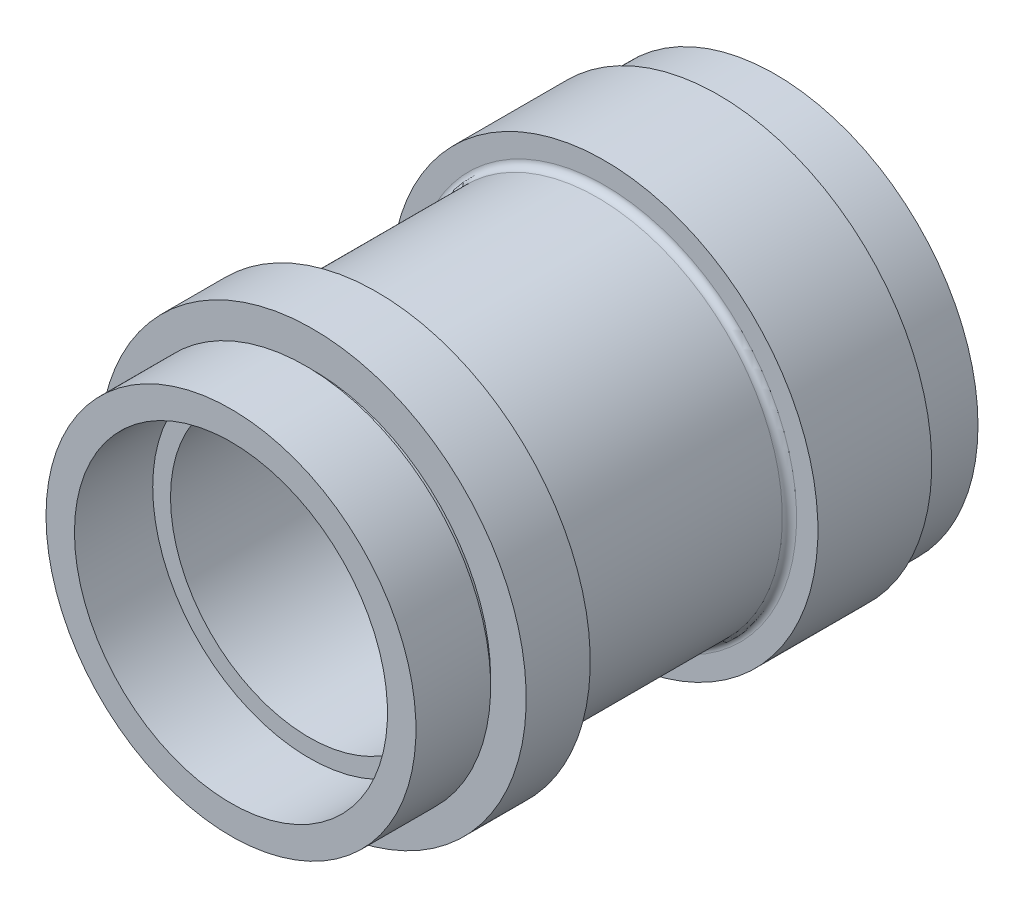
ISO-10303-21;
HEADER;
FILE_DESCRIPTION(('STEP AP214'),'2;1');
FILE_NAME('part.step','',(''),(''),'','','');
FILE_SCHEMA(('AUTOMOTIVE_DESIGN { 1 0 10303 214 1 1 1 1 }'));
ENDSEC;
DATA;
#1=APPLICATION_CONTEXT('core data for automotive mechanical design processes');
#2=APPLICATION_PROTOCOL_DEFINITION('international standard','automotive_design',2000,#1);
#3=PRODUCT_CONTEXT('',#1,'mechanical');
#4=PRODUCT('Part','Part','',(#3));
#5=PRODUCT_RELATED_PRODUCT_CATEGORY('part','',(#4));
#6=PRODUCT_DEFINITION_FORMATION('','',#4);
#7=PRODUCT_DEFINITION_CONTEXT('part definition',#1,'design');
#8=PRODUCT_DEFINITION('design','',#6,#7);
#9=PRODUCT_DEFINITION_SHAPE('','',#8);
#10=(LENGTH_UNIT() NAMED_UNIT(*) SI_UNIT(.MILLI.,.METRE.));
#11=(NAMED_UNIT(*) PLANE_ANGLE_UNIT() SI_UNIT($,.RADIAN.));
#12=(NAMED_UNIT(*) SI_UNIT($,.STERADIAN.) SOLID_ANGLE_UNIT());
#13=UNCERTAINTY_MEASURE_WITH_UNIT(LENGTH_MEASURE(1.E-05),#10,'distance_accuracy_value','');
#14=(GEOMETRIC_REPRESENTATION_CONTEXT(3) GLOBAL_UNCERTAINTY_ASSIGNED_CONTEXT((#13)) GLOBAL_UNIT_ASSIGNED_CONTEXT((#10,
#11,#12)) REPRESENTATION_CONTEXT('',''));
#15=CARTESIAN_POINT('',(0.,0.,0.));
#16=DIRECTION('',(0.,0.,1.));
#17=DIRECTION('',(1.,0.,0.));
#18=AXIS2_PLACEMENT_3D('',#15,#16,#17);
#19=CARTESIAN_POINT('',(0.,0.,32.5));
#20=DIRECTION('',(0.,0.,-1.));
#21=DIRECTION('',(-1.,0.,0.));
#22=AXIS2_PLACEMENT_3D('',#19,#20,#21);
#23=CYLINDRICAL_SURFACE('',#22,15.);
#24=CARTESIAN_POINT('',(0.,0.,28.));
#25=DIRECTION('',(0.,0.,-1.));
#26=DIRECTION('',(-1.,0.,0.));
#27=AXIS2_PLACEMENT_3D('',#24,#25,#26);
#28=CIRCLE('',#27,15.);
#29=CARTESIAN_POINT('',(-15.,0.,28.));
#30=VERTEX_POINT('',#29);
#31=EDGE_CURVE('E103',#30,#30,#28,.T.);
#32=CARTESIAN_POINT('',(0.,0.,32.5));
#33=DIRECTION('',(0.,0.,1.));
#34=DIRECTION('',(1.,0.,0.));
#35=AXIS2_PLACEMENT_3D('',#32,#33,#34);
#36=CIRCLE('',#35,15.);
#37=CARTESIAN_POINT('',(-15.,0.,32.5));
#38=VERTEX_POINT('',#37);
#39=EDGE_CURVE('E136',#38,#38,#36,.T.);
#40=CARTESIAN_POINT('',(-15.,0.,28.));
#41=CARTESIAN_POINT('',(-15.,0.,28.046875));
#42=CARTESIAN_POINT('',(-15.,0.,28.09375));
#43=CARTESIAN_POINT('',(-15.,0.,28.1875));
#44=CARTESIAN_POINT('',(-15.,0.,28.234375));
#45=CARTESIAN_POINT('',(-15.,0.,28.328125));
#46=CARTESIAN_POINT('',(-15.,0.,28.375));
#47=CARTESIAN_POINT('',(-15.,0.,28.46875));
#48=CARTESIAN_POINT('',(-15.,0.,28.515625));
#49=CARTESIAN_POINT('',(-15.,0.,28.609375));
#50=CARTESIAN_POINT('',(-15.,0.,28.65625));
#51=CARTESIAN_POINT('',(-15.,0.,28.75));
#52=CARTESIAN_POINT('',(-15.,0.,28.796875));
#53=CARTESIAN_POINT('',(-15.,0.,28.890625));
#54=CARTESIAN_POINT('',(-15.,0.,28.9375));
#55=CARTESIAN_POINT('',(-15.,0.,29.03125));
#56=CARTESIAN_POINT('',(-15.,0.,29.078125));
#57=CARTESIAN_POINT('',(-15.,0.,29.171875));
#58=CARTESIAN_POINT('',(-15.,0.,29.21875));
#59=CARTESIAN_POINT('',(-15.,0.,29.3125));
#60=CARTESIAN_POINT('',(-15.,0.,29.359375));
#61=CARTESIAN_POINT('',(-15.,0.,29.453125));
#62=CARTESIAN_POINT('',(-15.,0.,29.5));
#63=CARTESIAN_POINT('',(-15.,0.,29.59375));
#64=CARTESIAN_POINT('',(-15.,0.,29.640625));
#65=CARTESIAN_POINT('',(-15.,0.,29.734375));
#66=CARTESIAN_POINT('',(-15.,0.,29.78125));
#67=CARTESIAN_POINT('',(-15.,0.,29.875));
#68=CARTESIAN_POINT('',(-15.,0.,29.921875));
#69=CARTESIAN_POINT('',(-15.,0.,30.015625));
#70=CARTESIAN_POINT('',(-15.,0.,30.0625));
#71=CARTESIAN_POINT('',(-15.,0.,30.15625));
#72=CARTESIAN_POINT('',(-15.,0.,30.203125));
#73=CARTESIAN_POINT('',(-15.,0.,30.296875));
#74=CARTESIAN_POINT('',(-15.,0.,30.34375));
#75=CARTESIAN_POINT('',(-15.,0.,30.4375));
#76=CARTESIAN_POINT('',(-15.,0.,30.484375));
#77=CARTESIAN_POINT('',(-15.,0.,30.578125));
#78=CARTESIAN_POINT('',(-15.,0.,30.625));
#79=CARTESIAN_POINT('',(-15.,0.,30.71875));
#80=CARTESIAN_POINT('',(-15.,0.,30.765625));
#81=CARTESIAN_POINT('',(-15.,0.,30.859375));
#82=CARTESIAN_POINT('',(-15.,0.,30.90625));
#83=CARTESIAN_POINT('',(-15.,0.,31.));
#84=CARTESIAN_POINT('',(-15.,0.,31.046875));
#85=CARTESIAN_POINT('',(-15.,0.,31.140625));
#86=CARTESIAN_POINT('',(-15.,0.,31.1875));
#87=CARTESIAN_POINT('',(-15.,0.,31.28125));
#88=CARTESIAN_POINT('',(-15.,0.,31.328125));
#89=CARTESIAN_POINT('',(-15.,0.,31.421875));
#90=CARTESIAN_POINT('',(-15.,0.,31.46875));
#91=CARTESIAN_POINT('',(-15.,0.,31.5625));
#92=CARTESIAN_POINT('',(-15.,0.,31.609375));
#93=CARTESIAN_POINT('',(-15.,0.,31.703125));
#94=CARTESIAN_POINT('',(-15.,0.,31.75));
#95=CARTESIAN_POINT('',(-15.,0.,31.84375));
#96=CARTESIAN_POINT('',(-15.,0.,31.890625));
#97=CARTESIAN_POINT('',(-15.,0.,31.984375));
#98=CARTESIAN_POINT('',(-15.,0.,32.03125));
#99=CARTESIAN_POINT('',(-15.,0.,32.125));
#100=CARTESIAN_POINT('',(-15.,0.,32.171875));
#101=CARTESIAN_POINT('',(-15.,0.,32.265625));
#102=CARTESIAN_POINT('',(-15.,0.,32.3125));
#103=CARTESIAN_POINT('',(-15.,0.,32.40625));
#104=CARTESIAN_POINT('',(-15.,0.,32.453125));
#105=CARTESIAN_POINT('',(-15.,0.,32.5));
#106=B_SPLINE_CURVE_WITH_KNOTS('',3,(#40,#41,#42,#43,#44,#45,#46,#47,#48,#49,#50,#51,#52,#53,
#54,#55,#56,#57,#58,#59,#60,#61,#62,#63,#64,#65,#66,#67,#68,#69,#70,#71,#72,#73,#74,#75,#76,#77,
#78,#79,#80,#81,#82,#83,#84,#85,#86,#87,#88,#89,#90,#91,#92,#93,#94,#95,#96,#97,#98,#99,#100,
#101,#102,#103,#104,#105),.UNSPECIFIED.,.F.,.F.,(4,2,2,2,2,2,2,2,2,2,2,2,2,2,2,2,2,2,2,2,2,2,2,
2,2,2,2,2,2,2,2,2,4),(0.,0.140624999999998,0.28125,0.421874999999999,0.562499999999997,
0.703124999999999,0.843749999999997,0.984374999999996,1.125,1.265625,1.40624999999999,1.546875,
1.68749999999999,1.828125,1.96874999999999,2.10937499999999,2.25,2.39062499999999,2.53125,
2.67187499999999,2.81249999999999,2.95312499999999,3.09374999999999,3.23437499999999,
3.37499999999999,3.51562499999999,3.65624999999999,3.79687499999999,3.93749999999999,
4.07812499999999,4.21874999999999,4.35937499999999,4.49999999999999),.UNSPECIFIED.);
#107=EDGE_CURVE('BSEAM53',#30,#38,#106,.T.);
#108=ORIENTED_EDGE('',*,*,#31,.F.);
#109=ORIENTED_EDGE('',*,*,#39,.F.);
#110=ORIENTED_EDGE('',*,*,#107,.T.);
#111=ORIENTED_EDGE('',*,*,#107,.F.);
#112=EDGE_LOOP('',(#108,#110,#109,#111));
#113=FACE_BOUND('',#112,.T.);
#114=ADVANCED_FACE('F53',(#113),#23,.T.);
#115=CARTESIAN_POINT('',(0.,0.,32.5));
#116=DIRECTION('',(0.,0.,1.));
#117=DIRECTION('',(1.,0.,0.));
#118=AXIS2_PLACEMENT_3D('',#115,#116,#117);
#119=PLANE('',#118);
#120=CARTESIAN_POINT('',(0.,0.,32.5));
#121=DIRECTION('',(0.,0.,1.));
#122=DIRECTION('',(1.,0.,0.));
#123=AXIS2_PLACEMENT_3D('',#120,#121,#122);
#124=CIRCLE('',#123,12.5);
#125=CARTESIAN_POINT('',(12.5,0.,32.5));
#126=VERTEX_POINT('',#125);
#127=EDGE_CURVE('E11',#126,#126,#124,.T.);
#128=ORIENTED_EDGE('',*,*,#127,.F.);
#129=EDGE_LOOP('',(#128));
#130=FACE_BOUND('',#129,.T.);
#131=ORIENTED_EDGE('',*,*,#39,.T.);
#132=EDGE_LOOP('',(#131));
#133=FACE_BOUND('',#132,.T.);
#134=ADVANCED_FACE('F169',(#130,#133),#119,.T.);
#135=CARTESIAN_POINT('',(0.,0.,33.));
#136=DIRECTION('',(0.,0.,-1.));
#137=DIRECTION('',(-1.,0.,0.));
#138=AXIS2_PLACEMENT_3D('',#135,#136,#137);
#139=CYLINDRICAL_SURFACE('',#138,12.5);
#140=CARTESIAN_POINT('',(0.,0.,33.));
#141=DIRECTION('',(0.,0.,1.));
#142=DIRECTION('',(1.,0.,0.));
#143=AXIS2_PLACEMENT_3D('',#140,#141,#142);
#144=CIRCLE('',#143,12.5);
#145=CARTESIAN_POINT('',(12.5,0.,33.));
#146=VERTEX_POINT('',#145);
#147=EDGE_CURVE('E128',#146,#146,#144,.T.);
#148=ORIENTED_EDGE('',*,*,#147,.F.);
#149=EDGE_LOOP('',(#148));
#150=FACE_BOUND('',#149,.T.);
#151=ORIENTED_EDGE('',*,*,#127,.T.);
#152=EDGE_LOOP('',(#151));
#153=FACE_BOUND('',#152,.T.);
#154=ADVANCED_FACE('F176',(#150,#153),#139,.T.);
#155=CARTESIAN_POINT('',(0.,0.,38.25));
#156=DIRECTION('',(0.,0.,-1.));
#157=DIRECTION('',(-1.,0.,0.));
#158=AXIS2_PLACEMENT_3D('',#155,#156,#157);
#159=CYLINDRICAL_SURFACE('',#158,13.);
#160=CARTESIAN_POINT('',(0.,0.,38.25));
#161=DIRECTION('',(0.,0.,1.));
#162=DIRECTION('',(1.,0.,0.));
#163=AXIS2_PLACEMENT_3D('',#160,#161,#162);
#164=CIRCLE('',#163,13.);
#165=CARTESIAN_POINT('',(-13.,0.,38.25));
#166=VERTEX_POINT('',#165);
#167=EDGE_CURVE('E124',#166,#166,#164,.T.);
#168=CARTESIAN_POINT('',(0.,0.,33.));
#169=DIRECTION('',(0.,0.,1.));
#170=DIRECTION('',(1.,0.,0.));
#171=AXIS2_PLACEMENT_3D('',#168,#169,#170);
#172=CIRCLE('',#171,13.);
#173=CARTESIAN_POINT('',(-13.,0.,33.));
#174=VERTEX_POINT('',#173);
#175=EDGE_CURVE('E123',#174,#174,#172,.T.);
#176=CARTESIAN_POINT('',(-13.,0.,38.25));
#177=CARTESIAN_POINT('',(-13.,0.,38.1953125));
#178=CARTESIAN_POINT('',(-13.,0.,38.140625));
#179=CARTESIAN_POINT('',(-13.,0.,38.03125));
#180=CARTESIAN_POINT('',(-13.,0.,37.9765625));
#181=CARTESIAN_POINT('',(-13.,0.,37.8671875));
#182=CARTESIAN_POINT('',(-13.,0.,37.8125));
#183=CARTESIAN_POINT('',(-13.,0.,37.703125));
#184=CARTESIAN_POINT('',(-13.,0.,37.6484375));
#185=CARTESIAN_POINT('',(-13.,0.,37.5390625));
#186=CARTESIAN_POINT('',(-13.,0.,37.484375));
#187=CARTESIAN_POINT('',(-13.,0.,37.375));
#188=CARTESIAN_POINT('',(-13.,0.,37.3203125));
#189=CARTESIAN_POINT('',(-13.,0.,37.2109375));
#190=CARTESIAN_POINT('',(-13.,0.,37.15625));
#191=CARTESIAN_POINT('',(-13.,0.,37.046875));
#192=CARTESIAN_POINT('',(-13.,0.,36.9921875));
#193=CARTESIAN_POINT('',(-13.,0.,36.8828125));
#194=CARTESIAN_POINT('',(-13.,0.,36.828125));
#195=CARTESIAN_POINT('',(-13.,0.,36.71875));
#196=CARTESIAN_POINT('',(-13.,0.,36.6640625));
#197=CARTESIAN_POINT('',(-13.,0.,36.5546875));
#198=CARTESIAN_POINT('',(-13.,0.,36.5));
#199=CARTESIAN_POINT('',(-13.,0.,36.390625));
#200=CARTESIAN_POINT('',(-13.,0.,36.3359375));
#201=CARTESIAN_POINT('',(-13.,0.,36.2265625));
#202=CARTESIAN_POINT('',(-13.,0.,36.171875));
#203=CARTESIAN_POINT('',(-13.,0.,36.0625));
#204=CARTESIAN_POINT('',(-13.,0.,36.0078125));
#205=CARTESIAN_POINT('',(-13.,0.,35.8984375));
#206=CARTESIAN_POINT('',(-13.,0.,35.84375));
#207=CARTESIAN_POINT('',(-13.,0.,35.734375));
#208=CARTESIAN_POINT('',(-13.,0.,35.6796875));
#209=CARTESIAN_POINT('',(-13.,0.,35.5703125));
#210=CARTESIAN_POINT('',(-13.,0.,35.515625));
#211=CARTESIAN_POINT('',(-13.,0.,35.40625));
#212=CARTESIAN_POINT('',(-13.,0.,35.3515625));
#213=CARTESIAN_POINT('',(-13.,0.,35.2421875));
#214=CARTESIAN_POINT('',(-13.,0.,35.1875));
#215=CARTESIAN_POINT('',(-13.,0.,35.078125));
#216=CARTESIAN_POINT('',(-13.,0.,35.0234375));
#217=CARTESIAN_POINT('',(-13.,0.,34.9140625));
#218=CARTESIAN_POINT('',(-13.,0.,34.859375));
#219=CARTESIAN_POINT('',(-13.,0.,34.75));
#220=CARTESIAN_POINT('',(-13.,0.,34.6953125));
#221=CARTESIAN_POINT('',(-13.,0.,34.5859375));
#222=CARTESIAN_POINT('',(-13.,0.,34.53125));
#223=CARTESIAN_POINT('',(-13.,0.,34.421875));
#224=CARTESIAN_POINT('',(-13.,0.,34.3671875));
#225=CARTESIAN_POINT('',(-13.,0.,34.2578125));
#226=CARTESIAN_POINT('',(-13.,0.,34.203125));
#227=CARTESIAN_POINT('',(-13.,0.,34.09375));
#228=CARTESIAN_POINT('',(-13.,0.,34.0390625));
#229=CARTESIAN_POINT('',(-13.,0.,33.9296875));
#230=CARTESIAN_POINT('',(-13.,0.,33.875));
#231=CARTESIAN_POINT('',(-13.,0.,33.765625));
#232=CARTESIAN_POINT('',(-13.,0.,33.7109375));
#233=CARTESIAN_POINT('',(-13.,0.,33.6015625));
#234=CARTESIAN_POINT('',(-13.,0.,33.546875));
#235=CARTESIAN_POINT('',(-13.,0.,33.4375));
#236=CARTESIAN_POINT('',(-13.,0.,33.3828125));
#237=CARTESIAN_POINT('',(-13.,0.,33.2734375));
#238=CARTESIAN_POINT('',(-13.,0.,33.21875));
#239=CARTESIAN_POINT('',(-13.,0.,33.109375));
#240=CARTESIAN_POINT('',(-13.,0.,33.0546875));
#241=CARTESIAN_POINT('',(-13.,0.,33.));
#242=B_SPLINE_CURVE_WITH_KNOTS('',3,(#176,#177,#178,#179,#180,#181,#182,#183,#184,#185,#186,
#187,#188,#189,#190,#191,#192,#193,#194,#195,#196,#197,#198,#199,#200,#201,#202,#203,#204,#205,
#206,#207,#208,#209,#210,#211,#212,#213,#214,#215,#216,#217,#218,#219,#220,#221,#222,#223,#224,
#225,#226,#227,#228,#229,#230,#231,#232,#233,#234,#235,#236,#237,#238,#239,#240,#241),
.UNSPECIFIED.,.F.,.F.,(4,2,2,2,2,2,2,2,2,2,2,2,2,2,2,2,2,2,2,2,2,2,2,2,2,2,2,2,2,2,2,2,4),(0.,
0.164062500000006,0.328125000000005,0.492187500000005,0.656250000000004,0.820312500000003,
0.984375000000003,1.1484375,1.3125,1.4765625,1.640625,1.80468750000001,1.96875000000001,
2.1328125,2.296875,2.4609375,2.625,2.7890625,2.953125,3.1171875,3.28125,3.44531250000001,
3.609375,3.7734375,3.9375,4.1015625,4.265625,4.4296875,4.59375,4.7578125,4.921875,
5.08593750000001,5.25),.UNSPECIFIED.);
#243=EDGE_CURVE('BSEAM233',#166,#174,#242,.T.);
#244=ORIENTED_EDGE('',*,*,#167,.F.);
#245=ORIENTED_EDGE('',*,*,#175,.T.);
#246=ORIENTED_EDGE('',*,*,#243,.T.);
#247=ORIENTED_EDGE('',*,*,#243,.F.);
#248=EDGE_LOOP('',(#244,#246,#245,#247));
#249=FACE_BOUND('',#248,.T.);
#250=ADVANCED_FACE('F233',(#249),#159,.T.);
#251=CARTESIAN_POINT('',(0.,0.,38.25));
#252=DIRECTION('',(0.,0.,1.));
#253=DIRECTION('',(1.,0.,0.));
#254=AXIS2_PLACEMENT_3D('',#251,#252,#253);
#255=PLANE('',#254);
#256=CARTESIAN_POINT('',(0.,0.,38.25));
#257=DIRECTION('',(0.,0.,-1.));
#258=DIRECTION('',(-1.,0.,0.));
#259=AXIS2_PLACEMENT_3D('',#256,#257,#258);
#260=CIRCLE('',#259,11.);
#261=CARTESIAN_POINT('',(-11.,0.,38.25));
#262=VERTEX_POINT('',#261);
#263=EDGE_CURVE('E107',#262,#262,#260,.T.);
#264=ORIENTED_EDGE('',*,*,#263,.T.);
#265=EDGE_LOOP('',(#264));
#266=FACE_BOUND('',#265,.T.);
#267=ORIENTED_EDGE('',*,*,#167,.T.);
#268=EDGE_LOOP('',(#267));
#269=FACE_BOUND('',#268,.T.);
#270=ADVANCED_FACE('F231',(#266,#269),#255,.T.);
#271=CARTESIAN_POINT('',(0.,0.,33.));
#272=DIRECTION('',(0.,0.,1.));
#273=DIRECTION('',(1.,0.,0.));
#274=AXIS2_PLACEMENT_3D('',#271,#272,#273);
#275=PLANE('',#274);
#276=ORIENTED_EDGE('',*,*,#147,.T.);
#277=EDGE_LOOP('',(#276));
#278=FACE_BOUND('',#277,.T.);
#279=ORIENTED_EDGE('',*,*,#175,.F.);
#280=EDGE_LOOP('',(#279));
#281=FACE_BOUND('',#280,.T.);
#282=ADVANCED_FACE('F229',(#278,#281),#275,.F.);
#283=CARTESIAN_POINT('',(0.,0.,0.));
#284=DIRECTION('',(0.,0.,-1.));
#285=DIRECTION('',(-1.,0.,0.));
#286=AXIS2_PLACEMENT_3D('',#283,#284,#285);
#287=CYLINDRICAL_SURFACE('',#286,9.75);
#288=CARTESIAN_POINT('',(0.,0.,32.75));
#289=DIRECTION('',(0.,0.,-1.));
#290=DIRECTION('',(-1.,0.,0.));
#291=AXIS2_PLACEMENT_3D('',#288,#289,#290);
#292=CIRCLE('',#291,9.75);
#293=CARTESIAN_POINT('',(-9.75,0.,32.75));
#294=VERTEX_POINT('',#293);
#295=EDGE_CURVE('E115',#294,#294,#292,.T.);
#296=ORIENTED_EDGE('',*,*,#295,.F.);
#297=EDGE_LOOP('',(#296));
#298=FACE_BOUND('',#297,.T.);
#299=CARTESIAN_POINT('',(0.,0.,0.));
#300=DIRECTION('',(0.,0.,-1.));
#301=DIRECTION('',(-1.,0.,0.));
#302=AXIS2_PLACEMENT_3D('',#299,#300,#301);
#303=CIRCLE('',#302,9.75);
#304=CARTESIAN_POINT('',(-9.75,0.,0.));
#305=VERTEX_POINT('',#304);
#306=EDGE_CURVE('E119',#305,#305,#303,.T.);
#307=ORIENTED_EDGE('',*,*,#306,.T.);
#308=EDGE_LOOP('',(#307));
#309=FACE_BOUND('',#308,.T.);
#310=ADVANCED_FACE('F225',(#298,#309),#287,.F.);
#311=CARTESIAN_POINT('',(0.,9.75,32.75));
#312=DIRECTION('',(0.,0.,-1.));
#313=DIRECTION('',(-1.,0.,0.));
#314=AXIS2_PLACEMENT_3D('',#311,#312,#313);
#315=PLANE('',#314);
#316=CARTESIAN_POINT('',(0.,0.,32.75));
#317=DIRECTION('',(0.,0.,-1.));
#318=DIRECTION('',(-1.,0.,0.));
#319=AXIS2_PLACEMENT_3D('',#316,#317,#318);
#320=CIRCLE('',#319,11.);
#321=CARTESIAN_POINT('',(-11.,0.,32.75));
#322=VERTEX_POINT('',#321);
#323=EDGE_CURVE('E111',#322,#322,#320,.T.);
#324=ORIENTED_EDGE('',*,*,#323,.F.);
#325=EDGE_LOOP('',(#324));
#326=FACE_BOUND('',#325,.T.);
#327=ORIENTED_EDGE('',*,*,#295,.T.);
#328=EDGE_LOOP('',(#327));
#329=FACE_BOUND('',#328,.T.);
#330=ADVANCED_FACE('F221',(#326,#329),#315,.F.);
#331=CARTESIAN_POINT('',(0.,0.,0.));
#332=DIRECTION('',(0.,0.,-1.));
#333=DIRECTION('',(-1.,0.,0.));
#334=AXIS2_PLACEMENT_3D('',#331,#332,#333);
#335=CYLINDRICAL_SURFACE('',#334,11.);
#336=ORIENTED_EDGE('',*,*,#263,.F.);
#337=EDGE_LOOP('',(#336));
#338=FACE_BOUND('',#337,.T.);
#339=ORIENTED_EDGE('',*,*,#323,.T.);
#340=EDGE_LOOP('',(#339));
#341=FACE_BOUND('',#340,.T.);
#342=ADVANCED_FACE('F189',(#338,#341),#335,.F.);
#343=CARTESIAN_POINT('',(0.,0.,4.));
#344=DIRECTION('',(0.,0.,1.));
#345=DIRECTION('',(1.,0.,0.));
#346=AXIS2_PLACEMENT_3D('',#343,#344,#345);
#347=PLANE('',#346);
#348=CARTESIAN_POINT('',(0.,0.,4.));
#349=DIRECTION('',(0.,0.,1.));
#350=DIRECTION('',(1.,0.,0.));
#351=AXIS2_PLACEMENT_3D('',#348,#349,#350);
#352=CIRCLE('',#351,14.25);
#353=CARTESIAN_POINT('',(14.25,0.,4.));
#354=VERTEX_POINT('',#353);
#355=EDGE_CURVE('E62',#354,#354,#352,.T.);
#356=ORIENTED_EDGE('',*,*,#355,.T.);
#357=EDGE_LOOP('',(#356));
#358=FACE_BOUND('',#357,.T.);
#359=CARTESIAN_POINT('',(0.,0.,4.));
#360=DIRECTION('',(0.,0.,1.));
#361=DIRECTION('',(1.,0.,0.));
#362=AXIS2_PLACEMENT_3D('',#359,#360,#361);
#363=CIRCLE('',#362,15.);
#364=CARTESIAN_POINT('',(-15.,0.,4.));
#365=VERTEX_POINT('',#364);
#366=EDGE_CURVE('E134',#365,#365,#363,.T.);
#367=ORIENTED_EDGE('',*,*,#366,.F.);
#368=EDGE_LOOP('',(#367));
#369=FACE_BOUND('',#368,.T.);
#370=ADVANCED_FACE('F183',(#358,#369),#347,.F.);
#371=CARTESIAN_POINT('',(0.,0.,12.));
#372=DIRECTION('',(0.,0.,-1.));
#373=DIRECTION('',(-1.,0.,0.));
#374=AXIS2_PLACEMENT_3D('',#371,#372,#373);
#375=CIRCLE('',#374,15.);
#376=CARTESIAN_POINT('',(-15.,0.,12.));
#377=VERTEX_POINT('',#376);
#378=EDGE_CURVE('E99',#377,#377,#375,.T.);
#379=CARTESIAN_POINT('',(-15.,0.,12.));
#380=CARTESIAN_POINT('',(-15.,0.,11.9166666666667));
#381=CARTESIAN_POINT('',(-15.,0.,11.8333333333333));
#382=CARTESIAN_POINT('',(-15.,0.,11.6666666666667));
#383=CARTESIAN_POINT('',(-15.,0.,11.5833333333333));
#384=CARTESIAN_POINT('',(-15.,0.,11.4166666666667));
#385=CARTESIAN_POINT('',(-15.,0.,11.3333333333333));
#386=CARTESIAN_POINT('',(-15.,0.,11.1666666666667));
#387=CARTESIAN_POINT('',(-15.,0.,11.0833333333333));
#388=CARTESIAN_POINT('',(-15.,0.,10.9166666666667));
#389=CARTESIAN_POINT('',(-15.,0.,10.8333333333333));
#390=CARTESIAN_POINT('',(-15.,0.,10.6666666666667));
#391=CARTESIAN_POINT('',(-15.,0.,10.5833333333333));
#392=CARTESIAN_POINT('',(-15.,0.,10.4166666666667));
#393=CARTESIAN_POINT('',(-15.,0.,10.3333333333333));
#394=CARTESIAN_POINT('',(-15.,0.,10.1666666666667));
#395=CARTESIAN_POINT('',(-15.,0.,10.0833333333333));
#396=CARTESIAN_POINT('',(-15.,0.,9.91666666666667));
#397=CARTESIAN_POINT('',(-15.,0.,9.83333333333334));
#398=CARTESIAN_POINT('',(-15.,0.,9.66666666666667));
#399=CARTESIAN_POINT('',(-15.,0.,9.58333333333334));
#400=CARTESIAN_POINT('',(-15.,0.,9.41666666666667));
#401=CARTESIAN_POINT('',(-15.,0.,9.33333333333334));
#402=CARTESIAN_POINT('',(-15.,0.,9.16666666666667));
#403=CARTESIAN_POINT('',(-15.,0.,9.08333333333334));
#404=CARTESIAN_POINT('',(-15.,0.,8.91666666666667));
#405=CARTESIAN_POINT('',(-15.,0.,8.83333333333334));
#406=CARTESIAN_POINT('',(-15.,0.,8.66666666666667));
#407=CARTESIAN_POINT('',(-15.,0.,8.58333333333334));
#408=CARTESIAN_POINT('',(-15.,0.,8.41666666666667));
#409=CARTESIAN_POINT('',(-15.,0.,8.33333333333334));
#410=CARTESIAN_POINT('',(-15.,0.,8.16666666666667));
#411=CARTESIAN_POINT('',(-15.,0.,8.08333333333334));
#412=CARTESIAN_POINT('',(-15.,0.,7.91666666666667));
#413=CARTESIAN_POINT('',(-15.,0.,7.83333333333334));
#414=CARTESIAN_POINT('',(-15.,0.,7.66666666666667));
#415=CARTESIAN_POINT('',(-15.,0.,7.58333333333334));
#416=CARTESIAN_POINT('',(-15.,0.,7.41666666666667));
#417=CARTESIAN_POINT('',(-15.,0.,7.33333333333334));
#418=CARTESIAN_POINT('',(-15.,0.,7.16666666666667));
#419=CARTESIAN_POINT('',(-15.,0.,7.08333333333334));
#420=CARTESIAN_POINT('',(-15.,0.,6.91666666666667));
#421=CARTESIAN_POINT('',(-15.,0.,6.83333333333334));
#422=CARTESIAN_POINT('',(-15.,0.,6.66666666666667));
#423=CARTESIAN_POINT('',(-15.,0.,6.58333333333334));
#424=CARTESIAN_POINT('',(-15.,0.,6.41666666666667));
#425=CARTESIAN_POINT('',(-15.,0.,6.33333333333334));
#426=CARTESIAN_POINT('',(-15.,0.,6.16666666666667));
#427=CARTESIAN_POINT('',(-15.,0.,6.08333333333334));
#428=CARTESIAN_POINT('',(-15.,0.,5.91666666666667));
#429=CARTESIAN_POINT('',(-15.,0.,5.83333333333334));
#430=CARTESIAN_POINT('',(-15.,0.,5.66666666666667));
#431=CARTESIAN_POINT('',(-15.,0.,5.58333333333333));
#432=CARTESIAN_POINT('',(-15.,0.,5.41666666666667));
#433=CARTESIAN_POINT('',(-15.,0.,5.33333333333333));
#434=CARTESIAN_POINT('',(-15.,0.,5.16666666666667));
#435=CARTESIAN_POINT('',(-15.,0.,5.08333333333333));
#436=CARTESIAN_POINT('',(-15.,0.,4.91666666666667));
#437=CARTESIAN_POINT('',(-15.,0.,4.83333333333333));
#438=CARTESIAN_POINT('',(-15.,0.,4.66666666666667));
#439=CARTESIAN_POINT('',(-15.,0.,4.58333333333333));
#440=CARTESIAN_POINT('',(-15.,0.,4.41666666666667));
#441=CARTESIAN_POINT('',(-15.,0.,4.33333333333333));
#442=CARTESIAN_POINT('',(-15.,0.,4.16666666666667));
#443=CARTESIAN_POINT('',(-15.,0.,4.08333333333333));
#444=CARTESIAN_POINT('',(-15.,0.,4.));
#445=B_SPLINE_CURVE_WITH_KNOTS('',3,(#379,#380,#381,#382,#383,#384,#385,#386,#387,#388,#389,
#390,#391,#392,#393,#394,#395,#396,#397,#398,#399,#400,#401,#402,#403,#404,#405,#406,#407,#408,
#409,#410,#411,#412,#413,#414,#415,#416,#417,#418,#419,#420,#421,#422,#423,#424,#425,#426,#427,
#428,#429,#430,#431,#432,#433,#434,#435,#436,#437,#438,#439,#440,#441,#442,#443,#444),
.UNSPECIFIED.,.F.,.F.,(4,2,2,2,2,2,2,2,2,2,2,2,2,2,2,2,2,2,2,2,2,2,2,2,2,2,2,2,2,2,2,2,4),(0.,
0.25,0.5,0.750000000000001,1.,1.25,1.5,1.75,2.,2.25,2.5,2.75,3.,3.25,3.5,3.75,4.,4.25,4.5,4.75,
5.,5.25,5.50000000000001,5.75000000000001,6.00000000000001,6.25000000000001,6.50000000000001,
6.75000000000001,7.00000000000001,7.25000000000001,7.50000000000001,7.75000000000001,
8.00000000000001),.UNSPECIFIED.);
#446=EDGE_CURVE('BSEAM163',#377,#365,#445,.T.);
#447=ORIENTED_EDGE('',*,*,#378,.T.);
#448=ORIENTED_EDGE('',*,*,#366,.T.);
#449=ORIENTED_EDGE('',*,*,#446,.T.);
#450=ORIENTED_EDGE('',*,*,#446,.F.);
#451=EDGE_LOOP('',(#447,#449,#448,#450));
#452=FACE_BOUND('',#451,.T.);
#453=ADVANCED_FACE('F163',(#452),#23,.T.);
#454=CARTESIAN_POINT('',(0.,0.,4.));
#455=DIRECTION('',(0.,0.,-1.));
#456=DIRECTION('',(-1.,0.,0.));
#457=AXIS2_PLACEMENT_3D('',#454,#455,#456);
#458=CYLINDRICAL_SURFACE('',#457,14.25);
#459=ORIENTED_EDGE('',*,*,#355,.F.);
#460=EDGE_LOOP('',(#459));
#461=FACE_BOUND('',#460,.T.);
#462=CARTESIAN_POINT('',(0.,0.,0.));
#463=DIRECTION('',(0.,0.,1.));
#464=DIRECTION('',(1.,0.,0.));
#465=AXIS2_PLACEMENT_3D('',#462,#463,#464);
#466=CIRCLE('',#465,14.25);
#467=CARTESIAN_POINT('',(14.25,0.,0.));
#468=VERTEX_POINT('',#467);
#469=EDGE_CURVE('E57',#468,#468,#466,.T.);
#470=ORIENTED_EDGE('',*,*,#469,.T.);
#471=EDGE_LOOP('',(#470));
#472=FACE_BOUND('',#471,.T.);
#473=ADVANCED_FACE('F55',(#461,#472),#458,.T.);
#474=CARTESIAN_POINT('',(0.,0.,0.));
#475=DIRECTION('',(0.,0.,1.));
#476=DIRECTION('',(1.,0.,0.));
#477=AXIS2_PLACEMENT_3D('',#474,#475,#476);
#478=PLANE('',#477);
#479=CARTESIAN_POINT('',(0.,12.75,0.));
#480=DIRECTION('',(0.,0.,-1.));
#481=DIRECTION('',(-1.,0.,0.));
#482=AXIS2_PLACEMENT_3D('',#479,#480,#481);
#483=CIRCLE('',#482,0.999999999999989);
#484=CARTESIAN_POINT('',(-0.999999999999989,12.75,0.));
#485=VERTEX_POINT('',#484);
#486=EDGE_CURVE('E78',#485,#485,#483,.T.);
#487=ORIENTED_EDGE('',*,*,#486,.F.);
#488=EDGE_LOOP('',(#487));
#489=FACE_BOUND('',#488,.T.);
#490=ORIENTED_EDGE('',*,*,#306,.F.);
#491=EDGE_LOOP('',(#490));
#492=FACE_BOUND('',#491,.T.);
#493=ORIENTED_EDGE('',*,*,#469,.F.);
#494=EDGE_LOOP('',(#493));
#495=FACE_BOUND('',#494,.T.);
#496=ADVANCED_FACE('F151',(#489,#492,#495),#478,.F.);
#497=CARTESIAN_POINT('',(0.,15.,28.));
#498=DIRECTION('',(0.,0.,1.));
#499=DIRECTION('',(1.,0.,0.));
#500=AXIS2_PLACEMENT_3D('',#497,#498,#499);
#501=PLANE('',#500);
#502=CARTESIAN_POINT('',(0.,0.,28.));
#503=DIRECTION('',(0.,0.,-1.));
#504=DIRECTION('',(-1.,0.,0.));
#505=AXIS2_PLACEMENT_3D('',#502,#503,#504);
#506=CIRCLE('',#505,13.5);
#507=CARTESIAN_POINT('',(-13.5,0.,28.));
#508=VERTEX_POINT('',#507);
#509=EDGE_CURVE('E77',#508,#508,#506,.T.);
#510=ORIENTED_EDGE('',*,*,#509,.F.);
#511=EDGE_LOOP('',(#510));
#512=FACE_BOUND('',#511,.T.);
#513=ORIENTED_EDGE('',*,*,#31,.T.);
#514=EDGE_LOOP('',(#513));
#515=FACE_BOUND('',#514,.T.);
#516=ADVANCED_FACE('F153',(#512,#515),#501,.F.);
#517=CARTESIAN_POINT('',(0.,15.,12.));
#518=DIRECTION('',(0.,0.,-1.));
#519=DIRECTION('',(-1.,0.,0.));
#520=AXIS2_PLACEMENT_3D('',#517,#518,#519);
#521=PLANE('',#520);
#522=ORIENTED_EDGE('',*,*,#378,.F.);
#523=EDGE_LOOP('',(#522));
#524=FACE_BOUND('',#523,.T.);
#525=CARTESIAN_POINT('',(0.,0.,12.));
#526=DIRECTION('',(0.,0.,-1.));
#527=DIRECTION('',(-1.,0.,0.));
#528=AXIS2_PLACEMENT_3D('',#525,#526,#527);
#529=CIRCLE('',#528,13.5);
#530=CARTESIAN_POINT('',(-13.5,0.,12.));
#531=VERTEX_POINT('',#530);
#532=EDGE_CURVE('E95',#531,#531,#529,.T.);
#533=ORIENTED_EDGE('',*,*,#532,.T.);
#534=EDGE_LOOP('',(#533));
#535=FACE_BOUND('',#534,.T.);
#536=ADVANCED_FACE('F159',(#524,#535),#521,.F.);
#537=CARTESIAN_POINT('',(0.,0.,12.5));
#538=DIRECTION('',(0.,0.,-1.));
#539=DIRECTION('',(-1.,0.,0.));
#540=AXIS2_PLACEMENT_3D('',#537,#538,#539);
#541=TOROIDAL_SURFACE('',#540,13.5,0.5);
#542=ORIENTED_EDGE('',*,*,#532,.F.);
#543=EDGE_LOOP('',(#542));
#544=FACE_BOUND('',#543,.T.);
#545=CARTESIAN_POINT('',(0.,0.,12.5));
#546=DIRECTION('',(0.,0.,-1.));
#547=DIRECTION('',(-1.,0.,0.));
#548=AXIS2_PLACEMENT_3D('',#545,#546,#547);
#549=CIRCLE('',#548,13.);
#550=CARTESIAN_POINT('',(-13.,0.,12.5));
#551=VERTEX_POINT('',#550);
#552=EDGE_CURVE('E91',#551,#551,#549,.T.);
#553=ORIENTED_EDGE('',*,*,#552,.T.);
#554=EDGE_LOOP('',(#553));
#555=FACE_BOUND('',#554,.T.);
#556=ADVANCED_FACE('F197',(#544,#555),#541,.F.);
#557=CARTESIAN_POINT('',(0.,0.,0.));
#558=DIRECTION('',(0.,0.,-1.));
#559=DIRECTION('',(-1.,0.,0.));
#560=AXIS2_PLACEMENT_3D('',#557,#558,#559);
#561=CYLINDRICAL_SURFACE('',#560,13.);
#562=ORIENTED_EDGE('',*,*,#552,.F.);
#563=EDGE_LOOP('',(#562));
#564=FACE_BOUND('',#563,.T.);
#565=CARTESIAN_POINT('',(0.,0.,27.5));
#566=DIRECTION('',(0.,0.,-1.));
#567=DIRECTION('',(-1.,0.,0.));
#568=AXIS2_PLACEMENT_3D('',#565,#566,#567);
#569=CIRCLE('',#568,13.);
#570=CARTESIAN_POINT('',(-13.,0.,27.5));
#571=VERTEX_POINT('',#570);
#572=EDGE_CURVE('E83',#571,#571,#569,.T.);
#573=ORIENTED_EDGE('',*,*,#572,.T.);
#574=EDGE_LOOP('',(#573));
#575=FACE_BOUND('',#574,.T.);
#576=ADVANCED_FACE('F203',(#564,#575),#561,.T.);
#577=CARTESIAN_POINT('',(0.,0.,27.5));
#578=DIRECTION('',(0.,0.,-1.));
#579=DIRECTION('',(-1.,0.,0.));
#580=AXIS2_PLACEMENT_3D('',#577,#578,#579);
#581=TOROIDAL_SURFACE('',#580,13.5,0.5);
#582=ORIENTED_EDGE('',*,*,#572,.F.);
#583=EDGE_LOOP('',(#582));
#584=FACE_BOUND('',#583,.T.);
#585=ORIENTED_EDGE('',*,*,#509,.T.);
#586=EDGE_LOOP('',(#585));
#587=FACE_BOUND('',#586,.T.);
#588=ADVANCED_FACE('F70',(#584,#587),#581,.F.);
#589=CARTESIAN_POINT('',(0.,12.75,9.));
#590=DIRECTION('',(0.,0.,-1.));
#591=DIRECTION('',(-1.,0.,0.));
#592=AXIS2_PLACEMENT_3D('',#589,#590,#591);
#593=CONICAL_SURFACE('',#592,0.999999999999999,1.02974425867665);
#594=CARTESIAN_POINT('',(0.,12.75,9.60086061902756));
#595=VERTEX_POINT('',#594);
#596=VERTEX_LOOP('',#595);
#597=FACE_BOUND('',#596,.T.);
#598=CARTESIAN_POINT('',(0.,12.75,9.));
#599=DIRECTION('',(0.,0.,-1.));
#600=DIRECTION('',(-1.,0.,0.));
#601=AXIS2_PLACEMENT_3D('',#598,#599,#600);
#602=CIRCLE('',#601,0.999999999999999);
#603=CARTESIAN_POINT('',(-0.999999999999999,12.75,9.));
#604=VERTEX_POINT('',#603);
#605=EDGE_CURVE('E74',#604,#604,#602,.T.);
#606=ORIENTED_EDGE('',*,*,#605,.T.);
#607=EDGE_LOOP('',(#606));
#608=FACE_BOUND('',#607,.T.);
#609=ADVANCED_FACE('F66',(#597,#608),#593,.F.);
#610=CARTESIAN_POINT('',(0.,12.75,0.));
#611=DIRECTION('',(0.,0.,-1.));
#612=DIRECTION('',(-1.,0.,0.));
#613=AXIS2_PLACEMENT_3D('',#610,#611,#612);
#614=CYLINDRICAL_SURFACE('',#613,0.999999999999994);
#615=ORIENTED_EDGE('',*,*,#605,.F.);
#616=EDGE_LOOP('',(#615));
#617=FACE_BOUND('',#616,.T.);
#618=ORIENTED_EDGE('',*,*,#486,.T.);
#619=EDGE_LOOP('',(#618));
#620=FACE_BOUND('',#619,.T.);
#621=ADVANCED_FACE('F69',(#617,#620),#614,.F.);
#622=CLOSED_SHELL('',(#114,#134,#154,#250,#270,#282,#310,#330,#342,#370,#453,#473,#496,#516,
#536,#556,#576,#588,#609,#621));
#623=MANIFOLD_SOLID_BREP('B2',#622);
#624=ADVANCED_BREP_SHAPE_REPRESENTATION('',(#18,#623),#14);
#625=SHAPE_DEFINITION_REPRESENTATION(#9,#624);
ENDSEC;
END-ISO-10303-21;
